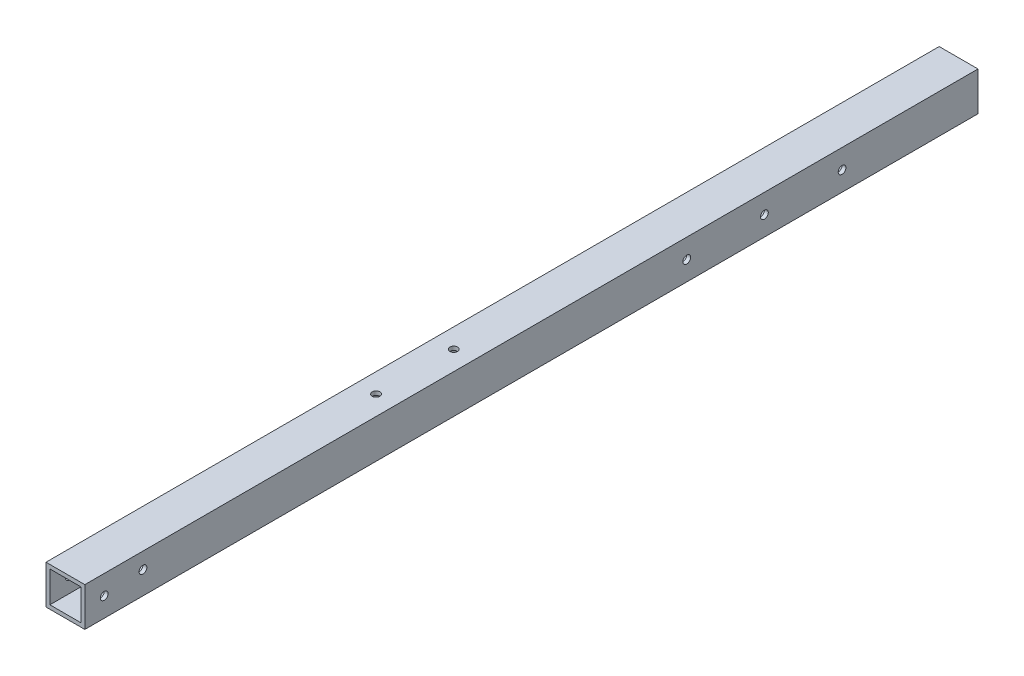
ISO-10303-21;
HEADER;
FILE_DESCRIPTION(('STEP AP214'),'2;1');
FILE_NAME('part.step','',(''),(''),'','','');
FILE_SCHEMA(('AUTOMOTIVE_DESIGN { 1 0 10303 214 1 1 1 1 }'));
ENDSEC;
DATA;
#1=APPLICATION_CONTEXT('core data for automotive mechanical design processes');
#2=APPLICATION_PROTOCOL_DEFINITION('international standard','automotive_design',2000,#1);
#3=PRODUCT_CONTEXT('',#1,'mechanical');
#4=PRODUCT('Part','Part','',(#3));
#5=PRODUCT_RELATED_PRODUCT_CATEGORY('part','',(#4));
#6=PRODUCT_DEFINITION_FORMATION('','',#4);
#7=PRODUCT_DEFINITION_CONTEXT('part definition',#1,'design');
#8=PRODUCT_DEFINITION('design','',#6,#7);
#9=PRODUCT_DEFINITION_SHAPE('','',#8);
#10=(LENGTH_UNIT() NAMED_UNIT(*) SI_UNIT(.MILLI.,.METRE.));
#11=(NAMED_UNIT(*) PLANE_ANGLE_UNIT() SI_UNIT($,.RADIAN.));
#12=(NAMED_UNIT(*) SI_UNIT($,.STERADIAN.) SOLID_ANGLE_UNIT());
#13=UNCERTAINTY_MEASURE_WITH_UNIT(LENGTH_MEASURE(1.E-05),#10,'distance_accuracy_value','');
#14=(GEOMETRIC_REPRESENTATION_CONTEXT(3) GLOBAL_UNCERTAINTY_ASSIGNED_CONTEXT((#13)) GLOBAL_UNIT_ASSIGNED_CONTEXT((#10,
#11,#12)) REPRESENTATION_CONTEXT('',''));
#15=CARTESIAN_POINT('',(0.,0.,0.));
#16=DIRECTION('',(0.,0.,1.));
#17=DIRECTION('',(1.,0.,0.));
#18=AXIS2_PLACEMENT_3D('',#15,#16,#17);
#19=CARTESIAN_POINT('',(0.,0.,460.));
#20=DIRECTION('',(0.,0.,-1.));
#21=DIRECTION('',(-1.,0.,0.));
#22=AXIS2_PLACEMENT_3D('',#19,#20,#21);
#23=PLANE('',#22);
#24=DIRECTION('',(0.,1.,0.));
#25=VECTOR('',#24,1.);
#26=CARTESIAN_POINT('',(10.,-10.,460.));
#27=LINE('',#26,#25);
#28=CARTESIAN_POINT('',(10.,-10.,460.));
#29=VERTEX_POINT('',#28);
#30=CARTESIAN_POINT('',(10.,10.,460.));
#31=VERTEX_POINT('',#30);
#32=EDGE_CURVE('E144',#29,#31,#27,.T.);
#33=ORIENTED_EDGE('',*,*,#32,.T.);
#34=DIRECTION('',(-1.,0.,0.));
#35=VECTOR('',#34,1.);
#36=CARTESIAN_POINT('',(-10.,10.,460.));
#37=LINE('',#36,#35);
#38=CARTESIAN_POINT('',(-10.,10.,460.));
#39=VERTEX_POINT('',#38);
#40=EDGE_CURVE('E147',#31,#39,#37,.T.);
#41=ORIENTED_EDGE('',*,*,#40,.T.);
#42=DIRECTION('',(0.,-1.,0.));
#43=VECTOR('',#42,1.);
#44=CARTESIAN_POINT('',(-10.,-10.,460.));
#45=LINE('',#44,#43);
#46=CARTESIAN_POINT('',(-10.,-10.,460.));
#47=VERTEX_POINT('',#46);
#48=EDGE_CURVE('E150',#39,#47,#45,.T.);
#49=ORIENTED_EDGE('',*,*,#48,.T.);
#50=DIRECTION('',(1.,0.,0.));
#51=VECTOR('',#50,1.);
#52=CARTESIAN_POINT('',(-10.,-10.,460.));
#53=LINE('',#52,#51);
#54=EDGE_CURVE('E152',#47,#29,#53,.T.);
#55=ORIENTED_EDGE('',*,*,#54,.T.);
#56=EDGE_LOOP('',(#33,#41,#49,#55));
#57=FACE_BOUND('',#56,.T.);
#58=DIRECTION('',(0.,1.,0.));
#59=VECTOR('',#58,1.);
#60=CARTESIAN_POINT('',(8.,8.,460.));
#61=LINE('',#60,#59);
#62=CARTESIAN_POINT('',(8.,-8.,460.));
#63=VERTEX_POINT('',#62);
#64=CARTESIAN_POINT('',(8.,8.,460.));
#65=VERTEX_POINT('',#64);
#66=EDGE_CURVE('E106',#63,#65,#61,.T.);
#67=ORIENTED_EDGE('',*,*,#66,.F.);
#68=DIRECTION('',(1.,0.,0.));
#69=VECTOR('',#68,1.);
#70=CARTESIAN_POINT('',(-8.,-8.,460.));
#71=LINE('',#70,#69);
#72=CARTESIAN_POINT('',(-8.,-8.,460.));
#73=VERTEX_POINT('',#72);
#74=EDGE_CURVE('E128',#73,#63,#71,.T.);
#75=ORIENTED_EDGE('',*,*,#74,.F.);
#76=DIRECTION('',(0.,-1.,0.));
#77=VECTOR('',#76,1.);
#78=CARTESIAN_POINT('',(-8.,8.,460.));
#79=LINE('',#78,#77);
#80=CARTESIAN_POINT('',(-8.,8.,460.));
#81=VERTEX_POINT('',#80);
#82=EDGE_CURVE('E126',#81,#73,#79,.T.);
#83=ORIENTED_EDGE('',*,*,#82,.F.);
#84=DIRECTION('',(-1.,0.,0.));
#85=VECTOR('',#84,1.);
#86=CARTESIAN_POINT('',(-8.,8.,460.));
#87=LINE('',#86,#85);
#88=EDGE_CURVE('E114',#65,#81,#87,.T.);
#89=ORIENTED_EDGE('',*,*,#88,.F.);
#90=EDGE_LOOP('',(#67,#75,#83,#89));
#91=FACE_BOUND('',#90,.T.);
#92=ADVANCED_FACE('F39',(#57,#91),#23,.F.);
#93=CARTESIAN_POINT('',(0.,0.,0.));
#94=DIRECTION('',(0.,0.,-1.));
#95=DIRECTION('',(-1.,0.,0.));
#96=AXIS2_PLACEMENT_3D('',#93,#94,#95);
#97=PLANE('',#96);
#98=DIRECTION('',(0.,1.,0.));
#99=VECTOR('',#98,1.);
#100=CARTESIAN_POINT('',(10.,-10.,0.));
#101=LINE('',#100,#99);
#102=CARTESIAN_POINT('',(10.,-10.,0.));
#103=VERTEX_POINT('',#102);
#104=CARTESIAN_POINT('',(10.,10.,0.));
#105=VERTEX_POINT('',#104);
#106=EDGE_CURVE('E122',#103,#105,#101,.T.);
#107=ORIENTED_EDGE('',*,*,#106,.F.);
#108=DIRECTION('',(1.,0.,0.));
#109=VECTOR('',#108,1.);
#110=CARTESIAN_POINT('',(-10.,-10.,0.));
#111=LINE('',#110,#109);
#112=CARTESIAN_POINT('',(-10.,-10.,0.));
#113=VERTEX_POINT('',#112);
#114=EDGE_CURVE('E148',#113,#103,#111,.T.);
#115=ORIENTED_EDGE('',*,*,#114,.F.);
#116=DIRECTION('',(0.,-1.,0.));
#117=VECTOR('',#116,1.);
#118=CARTESIAN_POINT('',(-10.,-10.,0.));
#119=LINE('',#118,#117);
#120=CARTESIAN_POINT('',(-10.,10.,0.));
#121=VERTEX_POINT('',#120);
#122=EDGE_CURVE('E159',#121,#113,#119,.T.);
#123=ORIENTED_EDGE('',*,*,#122,.F.);
#124=DIRECTION('',(-1.,0.,0.));
#125=VECTOR('',#124,1.);
#126=CARTESIAN_POINT('',(-10.,10.,0.));
#127=LINE('',#126,#125);
#128=EDGE_CURVE('E157',#105,#121,#127,.T.);
#129=ORIENTED_EDGE('',*,*,#128,.F.);
#130=EDGE_LOOP('',(#107,#115,#123,#129));
#131=FACE_BOUND('',#130,.T.);
#132=DIRECTION('',(1.,0.,0.));
#133=VECTOR('',#132,1.);
#134=CARTESIAN_POINT('',(-8.,-8.,0.));
#135=LINE('',#134,#133);
#136=CARTESIAN_POINT('',(-8.,-8.,0.));
#137=VERTEX_POINT('',#136);
#138=CARTESIAN_POINT('',(8.,-8.,0.));
#139=VERTEX_POINT('',#138);
#140=EDGE_CURVE('E115',#137,#139,#135,.T.);
#141=ORIENTED_EDGE('',*,*,#140,.T.);
#142=DIRECTION('',(0.,1.,0.));
#143=VECTOR('',#142,1.);
#144=CARTESIAN_POINT('',(8.,8.,0.));
#145=LINE('',#144,#143);
#146=CARTESIAN_POINT('',(8.,8.,0.));
#147=VERTEX_POINT('',#146);
#148=EDGE_CURVE('E64',#139,#147,#145,.T.);
#149=ORIENTED_EDGE('',*,*,#148,.T.);
#150=DIRECTION('',(-1.,0.,0.));
#151=VECTOR('',#150,1.);
#152=CARTESIAN_POINT('',(-8.,8.,0.));
#153=LINE('',#152,#151);
#154=CARTESIAN_POINT('',(-8.,8.,0.));
#155=VERTEX_POINT('',#154);
#156=EDGE_CURVE('E121',#147,#155,#153,.T.);
#157=ORIENTED_EDGE('',*,*,#156,.T.);
#158=DIRECTION('',(0.,-1.,0.));
#159=VECTOR('',#158,1.);
#160=CARTESIAN_POINT('',(-8.,8.,0.));
#161=LINE('',#160,#159);
#162=EDGE_CURVE('E136',#155,#137,#161,.T.);
#163=ORIENTED_EDGE('',*,*,#162,.T.);
#164=EDGE_LOOP('',(#141,#149,#157,#163));
#165=FACE_BOUND('',#164,.T.);
#166=ADVANCED_FACE('F279',(#131,#165),#97,.T.);
#167=CARTESIAN_POINT('',(10.,-10.,460.));
#168=DIRECTION('',(-1.,0.,0.));
#169=DIRECTION('',(0.,0.,1.));
#170=AXIS2_PLACEMENT_3D('',#167,#168,#169);
#171=PLANE('',#170);
#172=CARTESIAN_POINT('',(10.,0.,450.));
#173=DIRECTION('',(1.,0.,0.));
#174=DIRECTION('',(0.,0.,-1.));
#175=AXIS2_PLACEMENT_3D('',#172,#173,#174);
#176=CIRCLE('',#175,2.);
#177=CARTESIAN_POINT('',(10.,0.,448.));
#178=VERTEX_POINT('',#177);
#179=EDGE_CURVE('E216',#178,#178,#176,.T.);
#180=ORIENTED_EDGE('',*,*,#179,.F.);
#181=EDGE_LOOP('',(#180));
#182=FACE_BOUND('',#181,.T.);
#183=CARTESIAN_POINT('',(10.,-4.14197924260682E-12,150.));
#184=DIRECTION('',(1.,0.,0.));
#185=DIRECTION('',(0.,0.,-1.));
#186=AXIS2_PLACEMENT_3D('',#183,#184,#185);
#187=CIRCLE('',#186,2.);
#188=CARTESIAN_POINT('',(10.,-4.14197924260682E-12,148.));
#189=VERTEX_POINT('',#188);
#190=EDGE_CURVE('E227',#189,#189,#187,.T.);
#191=ORIENTED_EDGE('',*,*,#190,.F.);
#192=EDGE_LOOP('',(#191));
#193=FACE_BOUND('',#192,.T.);
#194=CARTESIAN_POINT('',(10.,-2.76131949507121E-12,110.));
#195=DIRECTION('',(1.,0.,0.));
#196=DIRECTION('',(0.,0.,-1.));
#197=AXIS2_PLACEMENT_3D('',#194,#195,#196);
#198=CIRCLE('',#197,2.00000000000001);
#199=CARTESIAN_POINT('',(10.,-2.76131949507121E-12,108.));
#200=VERTEX_POINT('',#199);
#201=EDGE_CURVE('E220',#200,#200,#198,.T.);
#202=ORIENTED_EDGE('',*,*,#201,.F.);
#203=EDGE_LOOP('',(#202));
#204=FACE_BOUND('',#203,.T.);
#205=CARTESIAN_POINT('',(10.,1.72258491226192,430.074320558129));
#206=DIRECTION('',(1.,0.,0.));
#207=DIRECTION('',(0.,0.,-1.));
#208=AXIS2_PLACEMENT_3D('',#205,#206,#207);
#209=CIRCLE('',#208,2.);
#210=CARTESIAN_POINT('',(10.,1.72258491226192,428.074320558129));
#211=VERTEX_POINT('',#210);
#212=EDGE_CURVE('E219',#211,#211,#209,.T.);
#213=ORIENTED_EDGE('',*,*,#212,.F.);
#214=EDGE_LOOP('',(#213));
#215=FACE_BOUND('',#214,.T.);
#216=CARTESIAN_POINT('',(10.,-1.38065974753561E-12,70.));
#217=DIRECTION('',(1.,0.,0.));
#218=DIRECTION('',(0.,0.,-1.));
#219=AXIS2_PLACEMENT_3D('',#216,#217,#218);
#220=CIRCLE('',#219,2.00000000000002);
#221=CARTESIAN_POINT('',(10.,-1.38065974753561E-12,68.));
#222=VERTEX_POINT('',#221);
#223=EDGE_CURVE('E232',#222,#222,#220,.T.);
#224=ORIENTED_EDGE('',*,*,#223,.F.);
#225=EDGE_LOOP('',(#224));
#226=FACE_BOUND('',#225,.T.);
#227=ORIENTED_EDGE('',*,*,#106,.T.);
#228=DIRECTION('',(0.,0.,-1.));
#229=VECTOR('',#228,1.);
#230=CARTESIAN_POINT('',(10.,10.,460.));
#231=LINE('',#230,#229);
#232=EDGE_CURVE('E11',#31,#105,#231,.T.);
#233=ORIENTED_EDGE('',*,*,#232,.F.);
#234=ORIENTED_EDGE('',*,*,#32,.F.);
#235=DIRECTION('',(0.,0.,-1.));
#236=VECTOR('',#235,1.);
#237=CARTESIAN_POINT('',(10.,-10.,460.));
#238=LINE('',#237,#236);
#239=EDGE_CURVE('E154',#29,#103,#238,.T.);
#240=ORIENTED_EDGE('',*,*,#239,.T.);
#241=EDGE_LOOP('',(#227,#233,#234,#240));
#242=FACE_BOUND('',#241,.T.);
#243=ADVANCED_FACE('F41',(#182,#193,#204,#215,#226,#242),#171,.F.);
#244=CARTESIAN_POINT('',(-10.,10.,460.));
#245=DIRECTION('',(0.,-1.,0.));
#246=DIRECTION('',(0.,0.,-1.));
#247=AXIS2_PLACEMENT_3D('',#244,#245,#246);
#248=PLANE('',#247);
#249=CARTESIAN_POINT('',(-1.47451495458029E-13,10.,260.));
#250=DIRECTION('',(0.,1.,0.));
#251=DIRECTION('',(0.,0.,1.));
#252=AXIS2_PLACEMENT_3D('',#249,#250,#251);
#253=CIRCLE('',#252,2.);
#254=CARTESIAN_POINT('',(-1.47451495458029E-13,10.,262.));
#255=VERTEX_POINT('',#254);
#256=EDGE_CURVE('E197',#255,#255,#253,.T.);
#257=ORIENTED_EDGE('',*,*,#256,.F.);
#258=EDGE_LOOP('',(#257));
#259=FACE_BOUND('',#258,.T.);
#260=CARTESIAN_POINT('',(-1.30104260698261E-13,10.,300.));
#261=DIRECTION('',(0.,1.,0.));
#262=DIRECTION('',(0.,0.,1.));
#263=AXIS2_PLACEMENT_3D('',#260,#261,#262);
#264=CIRCLE('',#263,2.);
#265=CARTESIAN_POINT('',(-1.30104260698261E-13,10.,302.));
#266=VERTEX_POINT('',#265);
#267=EDGE_CURVE('E202',#266,#266,#264,.T.);
#268=ORIENTED_EDGE('',*,*,#267,.F.);
#269=EDGE_LOOP('',(#268));
#270=FACE_BOUND('',#269,.T.);
#271=ORIENTED_EDGE('',*,*,#128,.T.);
#272=DIRECTION('',(0.,0.,-1.));
#273=VECTOR('',#272,1.);
#274=CARTESIAN_POINT('',(-10.,10.,460.));
#275=LINE('',#274,#273);
#276=EDGE_CURVE('E48',#39,#121,#275,.T.);
#277=ORIENTED_EDGE('',*,*,#276,.F.);
#278=ORIENTED_EDGE('',*,*,#40,.F.);
#279=ORIENTED_EDGE('',*,*,#232,.T.);
#280=EDGE_LOOP('',(#271,#277,#278,#279));
#281=FACE_BOUND('',#280,.T.);
#282=ADVANCED_FACE('F278',(#259,#270,#281),#248,.F.);
#283=CARTESIAN_POINT('',(-10.,-10.,460.));
#284=DIRECTION('',(1.,0.,0.));
#285=DIRECTION('',(0.,1.,0.));
#286=AXIS2_PLACEMENT_3D('',#283,#284,#285);
#287=PLANE('',#286);
#288=CARTESIAN_POINT('',(-10.,0.,450.));
#289=DIRECTION('',(1.,0.,0.));
#290=DIRECTION('',(0.,0.,-1.));
#291=AXIS2_PLACEMENT_3D('',#288,#289,#290);
#292=CIRCLE('',#291,2.);
#293=CARTESIAN_POINT('',(-10.,0.,448.));
#294=VERTEX_POINT('',#293);
#295=EDGE_CURVE('E173',#294,#294,#292,.T.);
#296=ORIENTED_EDGE('',*,*,#295,.T.);
#297=EDGE_LOOP('',(#296));
#298=FACE_BOUND('',#297,.T.);
#299=CARTESIAN_POINT('',(-10.,-4.14197924260682E-12,150.));
#300=DIRECTION('',(1.,0.,0.));
#301=DIRECTION('',(0.,0.,-1.));
#302=AXIS2_PLACEMENT_3D('',#299,#300,#301);
#303=CIRCLE('',#302,2.);
#304=CARTESIAN_POINT('',(-10.,-4.14197924260682E-12,148.));
#305=VERTEX_POINT('',#304);
#306=EDGE_CURVE('E213',#305,#305,#303,.T.);
#307=ORIENTED_EDGE('',*,*,#306,.T.);
#308=EDGE_LOOP('',(#307));
#309=FACE_BOUND('',#308,.T.);
#310=CARTESIAN_POINT('',(-10.,-2.76131949507121E-12,110.));
#311=DIRECTION('',(1.,0.,0.));
#312=DIRECTION('',(0.,0.,-1.));
#313=AXIS2_PLACEMENT_3D('',#310,#311,#312);
#314=CIRCLE('',#313,2.00000000000001);
#315=CARTESIAN_POINT('',(-10.,-2.76131949507121E-12,108.));
#316=VERTEX_POINT('',#315);
#317=EDGE_CURVE('E224',#316,#316,#314,.T.);
#318=ORIENTED_EDGE('',*,*,#317,.T.);
#319=EDGE_LOOP('',(#318));
#320=FACE_BOUND('',#319,.T.);
#321=CARTESIAN_POINT('',(-10.,1.72258491226192,430.074320558129));
#322=DIRECTION('',(1.,0.,0.));
#323=DIRECTION('',(0.,0.,-1.));
#324=AXIS2_PLACEMENT_3D('',#321,#322,#323);
#325=CIRCLE('',#324,2.);
#326=CARTESIAN_POINT('',(-10.,1.72258491226192,428.074320558129));
#327=VERTEX_POINT('',#326);
#328=EDGE_CURVE('E235',#327,#327,#325,.T.);
#329=ORIENTED_EDGE('',*,*,#328,.T.);
#330=EDGE_LOOP('',(#329));
#331=FACE_BOUND('',#330,.T.);
#332=CARTESIAN_POINT('',(-10.,-1.38065974753561E-12,70.));
#333=DIRECTION('',(1.,0.,0.));
#334=DIRECTION('',(0.,0.,-1.));
#335=AXIS2_PLACEMENT_3D('',#332,#333,#334);
#336=CIRCLE('',#335,2.00000000000002);
#337=CARTESIAN_POINT('',(-10.,-1.38065974753561E-12,68.));
#338=VERTEX_POINT('',#337);
#339=EDGE_CURVE('E223',#338,#338,#336,.T.);
#340=ORIENTED_EDGE('',*,*,#339,.T.);
#341=EDGE_LOOP('',(#340));
#342=FACE_BOUND('',#341,.T.);
#343=ORIENTED_EDGE('',*,*,#122,.T.);
#344=DIRECTION('',(0.,0.,-1.));
#345=VECTOR('',#344,1.);
#346=CARTESIAN_POINT('',(-10.,-10.,460.));
#347=LINE('',#346,#345);
#348=EDGE_CURVE('E164',#47,#113,#347,.T.);
#349=ORIENTED_EDGE('',*,*,#348,.F.);
#350=ORIENTED_EDGE('',*,*,#48,.F.);
#351=ORIENTED_EDGE('',*,*,#276,.T.);
#352=EDGE_LOOP('',(#343,#349,#350,#351));
#353=FACE_BOUND('',#352,.T.);
#354=ADVANCED_FACE('F297',(#298,#309,#320,#331,#342,#353),#287,.F.);
#355=CARTESIAN_POINT('',(-10.,-10.,460.));
#356=DIRECTION('',(0.,1.,0.));
#357=DIRECTION('',(0.,0.,1.));
#358=AXIS2_PLACEMENT_3D('',#355,#356,#357);
#359=PLANE('',#358);
#360=CARTESIAN_POINT('',(-1.47451495458029E-13,-10.,260.));
#361=DIRECTION('',(0.,1.,0.));
#362=DIRECTION('',(0.,0.,1.));
#363=AXIS2_PLACEMENT_3D('',#360,#361,#362);
#364=CIRCLE('',#363,2.);
#365=CARTESIAN_POINT('',(-1.47451495458029E-13,-10.,262.));
#366=VERTEX_POINT('',#365);
#367=EDGE_CURVE('E191',#366,#366,#364,.T.);
#368=ORIENTED_EDGE('',*,*,#367,.T.);
#369=EDGE_LOOP('',(#368));
#370=FACE_BOUND('',#369,.T.);
#371=CARTESIAN_POINT('',(-1.30104260698261E-13,-10.,300.));
#372=DIRECTION('',(0.,1.,0.));
#373=DIRECTION('',(0.,0.,1.));
#374=AXIS2_PLACEMENT_3D('',#371,#372,#373);
#375=CIRCLE('',#374,2.);
#376=CARTESIAN_POINT('',(-1.30104260698261E-13,-10.,302.));
#377=VERTEX_POINT('',#376);
#378=EDGE_CURVE('E207',#377,#377,#375,.T.);
#379=ORIENTED_EDGE('',*,*,#378,.T.);
#380=EDGE_LOOP('',(#379));
#381=FACE_BOUND('',#380,.T.);
#382=ORIENTED_EDGE('',*,*,#114,.T.);
#383=ORIENTED_EDGE('',*,*,#239,.F.);
#384=ORIENTED_EDGE('',*,*,#54,.F.);
#385=ORIENTED_EDGE('',*,*,#348,.T.);
#386=EDGE_LOOP('',(#382,#383,#384,#385));
#387=FACE_BOUND('',#386,.T.);
#388=ADVANCED_FACE('F257',(#370,#381,#387),#359,.F.);
#389=CARTESIAN_POINT('',(8.,8.,460.));
#390=DIRECTION('',(-1.,0.,0.));
#391=DIRECTION('',(0.,-1.,0.));
#392=AXIS2_PLACEMENT_3D('',#389,#390,#391);
#393=PLANE('',#392);
#394=CARTESIAN_POINT('',(8.,0.,450.));
#395=DIRECTION('',(-1.,0.,0.));
#396=DIRECTION('',(0.,-1.,0.));
#397=AXIS2_PLACEMENT_3D('',#394,#395,#396);
#398=CIRCLE('',#397,2.);
#399=CARTESIAN_POINT('',(8.,-2.,450.));
#400=VERTEX_POINT('',#399);
#401=EDGE_CURVE('E134',#400,#400,#398,.T.);
#402=ORIENTED_EDGE('',*,*,#401,.F.);
#403=EDGE_LOOP('',(#402));
#404=FACE_BOUND('',#403,.T.);
#405=CARTESIAN_POINT('',(8.,-4.14197924260682E-12,150.));
#406=DIRECTION('',(-1.,0.,0.));
#407=DIRECTION('',(0.,-1.,0.));
#408=AXIS2_PLACEMENT_3D('',#405,#406,#407);
#409=CIRCLE('',#408,2.);
#410=CARTESIAN_POINT('',(8.,-2.00000000000414,150.));
#411=VERTEX_POINT('',#410);
#412=EDGE_CURVE('E185',#411,#411,#409,.T.);
#413=ORIENTED_EDGE('',*,*,#412,.F.);
#414=EDGE_LOOP('',(#413));
#415=FACE_BOUND('',#414,.T.);
#416=CARTESIAN_POINT('',(8.,-2.76131949507121E-12,110.));
#417=DIRECTION('',(-1.,0.,0.));
#418=DIRECTION('',(0.,-1.,0.));
#419=AXIS2_PLACEMENT_3D('',#416,#417,#418);
#420=CIRCLE('',#419,2.00000000000001);
#421=CARTESIAN_POINT('',(8.,-2.00000000000277,110.));
#422=VERTEX_POINT('',#421);
#423=EDGE_CURVE('E181',#422,#422,#420,.T.);
#424=ORIENTED_EDGE('',*,*,#423,.F.);
#425=EDGE_LOOP('',(#424));
#426=FACE_BOUND('',#425,.T.);
#427=CARTESIAN_POINT('',(8.,1.72258491226192,430.074320558129));
#428=DIRECTION('',(-1.,0.,0.));
#429=DIRECTION('',(0.,-1.,0.));
#430=AXIS2_PLACEMENT_3D('',#427,#428,#429);
#431=CIRCLE('',#430,2.);
#432=CARTESIAN_POINT('',(8.,-0.277415087738076,430.074320558129));
#433=VERTEX_POINT('',#432);
#434=EDGE_CURVE('E177',#433,#433,#431,.T.);
#435=ORIENTED_EDGE('',*,*,#434,.F.);
#436=EDGE_LOOP('',(#435));
#437=FACE_BOUND('',#436,.T.);
#438=CARTESIAN_POINT('',(8.,-1.38065974753561E-12,70.));
#439=DIRECTION('',(-1.,0.,0.));
#440=DIRECTION('',(0.,-1.,0.));
#441=AXIS2_PLACEMENT_3D('',#438,#439,#440);
#442=CIRCLE('',#441,2.00000000000002);
#443=CARTESIAN_POINT('',(8.,-2.0000000000014,70.));
#444=VERTEX_POINT('',#443);
#445=EDGE_CURVE('E172',#444,#444,#442,.T.);
#446=ORIENTED_EDGE('',*,*,#445,.F.);
#447=EDGE_LOOP('',(#446));
#448=FACE_BOUND('',#447,.T.);
#449=ORIENTED_EDGE('',*,*,#148,.F.);
#450=DIRECTION('',(0.,0.,-1.));
#451=VECTOR('',#450,1.);
#452=CARTESIAN_POINT('',(8.,-8.,460.));
#453=LINE('',#452,#451);
#454=EDGE_CURVE('E110',#63,#139,#453,.T.);
#455=ORIENTED_EDGE('',*,*,#454,.F.);
#456=ORIENTED_EDGE('',*,*,#66,.T.);
#457=DIRECTION('',(0.,0.,-1.));
#458=VECTOR('',#457,1.);
#459=CARTESIAN_POINT('',(8.,8.,460.));
#460=LINE('',#459,#458);
#461=EDGE_CURVE('E109',#65,#147,#460,.T.);
#462=ORIENTED_EDGE('',*,*,#461,.T.);
#463=EDGE_LOOP('',(#449,#455,#456,#462));
#464=FACE_BOUND('',#463,.T.);
#465=ADVANCED_FACE('F108',(#404,#415,#426,#437,#448,#464),#393,.T.);
#466=CARTESIAN_POINT('',(-8.,8.,460.));
#467=DIRECTION('',(0.,-1.,0.));
#468=DIRECTION('',(0.,0.,-1.));
#469=AXIS2_PLACEMENT_3D('',#466,#467,#468);
#470=PLANE('',#469);
#471=CARTESIAN_POINT('',(-1.47451495458029E-13,8.,260.));
#472=DIRECTION('',(0.,-1.,0.));
#473=DIRECTION('',(0.,0.,-1.));
#474=AXIS2_PLACEMENT_3D('',#471,#472,#473);
#475=CIRCLE('',#474,2.);
#476=CARTESIAN_POINT('',(-1.47451495458029E-13,8.,258.));
#477=VERTEX_POINT('',#476);
#478=EDGE_CURVE('E210',#477,#477,#475,.T.);
#479=ORIENTED_EDGE('',*,*,#478,.F.);
#480=EDGE_LOOP('',(#479));
#481=FACE_BOUND('',#480,.T.);
#482=CARTESIAN_POINT('',(-1.30104260698261E-13,8.,300.));
#483=DIRECTION('',(0.,-1.,0.));
#484=DIRECTION('',(0.,0.,-1.));
#485=AXIS2_PLACEMENT_3D('',#482,#483,#484);
#486=CIRCLE('',#485,2.);
#487=CARTESIAN_POINT('',(-1.30104260698261E-13,8.,298.));
#488=VERTEX_POINT('',#487);
#489=EDGE_CURVE('E190',#488,#488,#486,.T.);
#490=ORIENTED_EDGE('',*,*,#489,.F.);
#491=EDGE_LOOP('',(#490));
#492=FACE_BOUND('',#491,.T.);
#493=ORIENTED_EDGE('',*,*,#156,.F.);
#494=ORIENTED_EDGE('',*,*,#461,.F.);
#495=ORIENTED_EDGE('',*,*,#88,.T.);
#496=DIRECTION('',(0.,0.,-1.));
#497=VECTOR('',#496,1.);
#498=CARTESIAN_POINT('',(-8.,8.,460.));
#499=LINE('',#498,#497);
#500=EDGE_CURVE('E123',#81,#155,#499,.T.);
#501=ORIENTED_EDGE('',*,*,#500,.T.);
#502=EDGE_LOOP('',(#493,#494,#495,#501));
#503=FACE_BOUND('',#502,.T.);
#504=ADVANCED_FACE('F118',(#481,#492,#503),#470,.T.);
#505=CARTESIAN_POINT('',(-8.,8.,460.));
#506=DIRECTION('',(1.,0.,0.));
#507=DIRECTION('',(0.,1.,0.));
#508=AXIS2_PLACEMENT_3D('',#505,#506,#507);
#509=PLANE('',#508);
#510=CARTESIAN_POINT('',(-8.,0.,450.));
#511=DIRECTION('',(1.,0.,0.));
#512=DIRECTION('',(0.,1.,0.));
#513=AXIS2_PLACEMENT_3D('',#510,#511,#512);
#514=CIRCLE('',#513,2.);
#515=CARTESIAN_POINT('',(-8.,2.,450.));
#516=VERTEX_POINT('',#515);
#517=EDGE_CURVE('E186',#516,#516,#514,.T.);
#518=ORIENTED_EDGE('',*,*,#517,.F.);
#519=EDGE_LOOP('',(#518));
#520=FACE_BOUND('',#519,.T.);
#521=CARTESIAN_POINT('',(-8.,-4.14197924260682E-12,150.));
#522=DIRECTION('',(1.,0.,0.));
#523=DIRECTION('',(0.,1.,0.));
#524=AXIS2_PLACEMENT_3D('',#521,#522,#523);
#525=CIRCLE('',#524,2.);
#526=CARTESIAN_POINT('',(-8.,1.99999999999585,150.));
#527=VERTEX_POINT('',#526);
#528=EDGE_CURVE('E182',#527,#527,#525,.T.);
#529=ORIENTED_EDGE('',*,*,#528,.F.);
#530=EDGE_LOOP('',(#529));
#531=FACE_BOUND('',#530,.T.);
#532=CARTESIAN_POINT('',(-8.,-2.76131949507121E-12,110.));
#533=DIRECTION('',(1.,0.,0.));
#534=DIRECTION('',(0.,1.,0.));
#535=AXIS2_PLACEMENT_3D('',#532,#533,#534);
#536=CIRCLE('',#535,2.00000000000001);
#537=CARTESIAN_POINT('',(-8.,1.99999999999725,110.));
#538=VERTEX_POINT('',#537);
#539=EDGE_CURVE('E178',#538,#538,#536,.T.);
#540=ORIENTED_EDGE('',*,*,#539,.F.);
#541=EDGE_LOOP('',(#540));
#542=FACE_BOUND('',#541,.T.);
#543=CARTESIAN_POINT('',(-8.,1.72258491226192,430.074320558129));
#544=DIRECTION('',(1.,0.,0.));
#545=DIRECTION('',(0.,1.,0.));
#546=AXIS2_PLACEMENT_3D('',#543,#544,#545);
#547=CIRCLE('',#546,2.);
#548=CARTESIAN_POINT('',(-8.,3.72258491226192,430.074320558129));
#549=VERTEX_POINT('',#548);
#550=EDGE_CURVE('E174',#549,#549,#547,.T.);
#551=ORIENTED_EDGE('',*,*,#550,.F.);
#552=EDGE_LOOP('',(#551));
#553=FACE_BOUND('',#552,.T.);
#554=CARTESIAN_POINT('',(-8.,-1.38065974753561E-12,70.));
#555=DIRECTION('',(1.,0.,0.));
#556=DIRECTION('',(0.,1.,0.));
#557=AXIS2_PLACEMENT_3D('',#554,#555,#556);
#558=CIRCLE('',#557,2.00000000000002);
#559=CARTESIAN_POINT('',(-8.,1.99999999999864,70.));
#560=VERTEX_POINT('',#559);
#561=EDGE_CURVE('E169',#560,#560,#558,.T.);
#562=ORIENTED_EDGE('',*,*,#561,.F.);
#563=EDGE_LOOP('',(#562));
#564=FACE_BOUND('',#563,.T.);
#565=ORIENTED_EDGE('',*,*,#162,.F.);
#566=ORIENTED_EDGE('',*,*,#500,.F.);
#567=ORIENTED_EDGE('',*,*,#82,.T.);
#568=DIRECTION('',(0.,0.,-1.));
#569=VECTOR('',#568,1.);
#570=CARTESIAN_POINT('',(-8.,-8.,460.));
#571=LINE('',#570,#569);
#572=EDGE_CURVE('E56',#73,#137,#571,.T.);
#573=ORIENTED_EDGE('',*,*,#572,.T.);
#574=EDGE_LOOP('',(#565,#566,#567,#573));
#575=FACE_BOUND('',#574,.T.);
#576=ADVANCED_FACE('F317',(#520,#531,#542,#553,#564,#575),#509,.T.);
#577=CARTESIAN_POINT('',(-8.,-8.,460.));
#578=DIRECTION('',(0.,1.,0.));
#579=DIRECTION('',(-1.,0.,0.));
#580=AXIS2_PLACEMENT_3D('',#577,#578,#579);
#581=PLANE('',#580);
#582=CARTESIAN_POINT('',(-1.47451495458029E-13,-8.,260.));
#583=DIRECTION('',(0.,1.,0.));
#584=DIRECTION('',(-1.,0.,0.));
#585=AXIS2_PLACEMENT_3D('',#582,#583,#584);
#586=CIRCLE('',#585,2.);
#587=CARTESIAN_POINT('',(-2.00000000000015,-8.,260.));
#588=VERTEX_POINT('',#587);
#589=EDGE_CURVE('E43',#588,#588,#586,.T.);
#590=ORIENTED_EDGE('',*,*,#589,.F.);
#591=EDGE_LOOP('',(#590));
#592=FACE_BOUND('',#591,.T.);
#593=CARTESIAN_POINT('',(-1.30104260698261E-13,-8.,300.));
#594=DIRECTION('',(0.,1.,0.));
#595=DIRECTION('',(-1.,0.,0.));
#596=AXIS2_PLACEMENT_3D('',#593,#594,#595);
#597=CIRCLE('',#596,2.);
#598=CARTESIAN_POINT('',(-2.00000000000013,-8.,300.));
#599=VERTEX_POINT('',#598);
#600=EDGE_CURVE('E188',#599,#599,#597,.T.);
#601=ORIENTED_EDGE('',*,*,#600,.F.);
#602=EDGE_LOOP('',(#601));
#603=FACE_BOUND('',#602,.T.);
#604=ORIENTED_EDGE('',*,*,#140,.F.);
#605=ORIENTED_EDGE('',*,*,#572,.F.);
#606=ORIENTED_EDGE('',*,*,#74,.T.);
#607=ORIENTED_EDGE('',*,*,#454,.T.);
#608=EDGE_LOOP('',(#604,#605,#606,#607));
#609=FACE_BOUND('',#608,.T.);
#610=ADVANCED_FACE('F321',(#592,#603,#609),#581,.T.);
#611=CARTESIAN_POINT('',(-10.,-1.38065974753561E-12,70.));
#612=DIRECTION('',(1.,0.,0.));
#613=DIRECTION('',(0.,0.,-1.));
#614=AXIS2_PLACEMENT_3D('',#611,#612,#613);
#615=CYLINDRICAL_SURFACE('',#614,2.00000000000002);
#616=ORIENTED_EDGE('',*,*,#561,.T.);
#617=EDGE_LOOP('',(#616));
#618=FACE_BOUND('',#617,.T.);
#619=ORIENTED_EDGE('',*,*,#339,.F.);
#620=EDGE_LOOP('',(#619));
#621=FACE_BOUND('',#620,.T.);
#622=ADVANCED_FACE('F273',(#618,#621),#615,.F.);
#623=CARTESIAN_POINT('',(-10.,1.72258491226192,430.074320558129));
#624=DIRECTION('',(1.,0.,0.));
#625=DIRECTION('',(0.,0.,-1.));
#626=AXIS2_PLACEMENT_3D('',#623,#624,#625);
#627=CYLINDRICAL_SURFACE('',#626,2.);
#628=ORIENTED_EDGE('',*,*,#550,.T.);
#629=EDGE_LOOP('',(#628));
#630=FACE_BOUND('',#629,.T.);
#631=ORIENTED_EDGE('',*,*,#328,.F.);
#632=EDGE_LOOP('',(#631));
#633=FACE_BOUND('',#632,.T.);
#634=ADVANCED_FACE('F326',(#630,#633),#627,.F.);
#635=CARTESIAN_POINT('',(-10.,-2.76131949507121E-12,110.));
#636=DIRECTION('',(1.,0.,0.));
#637=DIRECTION('',(0.,0.,-1.));
#638=AXIS2_PLACEMENT_3D('',#635,#636,#637);
#639=CYLINDRICAL_SURFACE('',#638,2.00000000000001);
#640=ORIENTED_EDGE('',*,*,#539,.T.);
#641=EDGE_LOOP('',(#640));
#642=FACE_BOUND('',#641,.T.);
#643=ORIENTED_EDGE('',*,*,#317,.F.);
#644=EDGE_LOOP('',(#643));
#645=FACE_BOUND('',#644,.T.);
#646=ADVANCED_FACE('F328',(#642,#645),#639,.F.);
#647=CARTESIAN_POINT('',(-10.,-4.14197924260682E-12,150.));
#648=DIRECTION('',(1.,0.,0.));
#649=DIRECTION('',(0.,0.,-1.));
#650=AXIS2_PLACEMENT_3D('',#647,#648,#649);
#651=CYLINDRICAL_SURFACE('',#650,2.);
#652=ORIENTED_EDGE('',*,*,#528,.T.);
#653=EDGE_LOOP('',(#652));
#654=FACE_BOUND('',#653,.T.);
#655=ORIENTED_EDGE('',*,*,#306,.F.);
#656=EDGE_LOOP('',(#655));
#657=FACE_BOUND('',#656,.T.);
#658=ADVANCED_FACE('F333',(#654,#657),#651,.F.);
#659=CARTESIAN_POINT('',(-10.,0.,450.));
#660=DIRECTION('',(1.,0.,0.));
#661=DIRECTION('',(0.,0.,-1.));
#662=AXIS2_PLACEMENT_3D('',#659,#660,#661);
#663=CYLINDRICAL_SURFACE('',#662,2.);
#664=ORIENTED_EDGE('',*,*,#517,.T.);
#665=EDGE_LOOP('',(#664));
#666=FACE_BOUND('',#665,.T.);
#667=ORIENTED_EDGE('',*,*,#295,.F.);
#668=EDGE_LOOP('',(#667));
#669=FACE_BOUND('',#668,.T.);
#670=ADVANCED_FACE('F271',(#666,#669),#663,.F.);
#671=ORIENTED_EDGE('',*,*,#445,.T.);
#672=EDGE_LOOP('',(#671));
#673=FACE_BOUND('',#672,.T.);
#674=ORIENTED_EDGE('',*,*,#223,.T.);
#675=EDGE_LOOP('',(#674));
#676=FACE_BOUND('',#675,.T.);
#677=ADVANCED_FACE('F267',(#673,#676),#615,.F.);
#678=ORIENTED_EDGE('',*,*,#434,.T.);
#679=EDGE_LOOP('',(#678));
#680=FACE_BOUND('',#679,.T.);
#681=ORIENTED_EDGE('',*,*,#212,.T.);
#682=EDGE_LOOP('',(#681));
#683=FACE_BOUND('',#682,.T.);
#684=ADVANCED_FACE('F270',(#680,#683),#627,.F.);
#685=ORIENTED_EDGE('',*,*,#423,.T.);
#686=EDGE_LOOP('',(#685));
#687=FACE_BOUND('',#686,.T.);
#688=ORIENTED_EDGE('',*,*,#201,.T.);
#689=EDGE_LOOP('',(#688));
#690=FACE_BOUND('',#689,.T.);
#691=ADVANCED_FACE('F341',(#687,#690),#639,.F.);
#692=ORIENTED_EDGE('',*,*,#412,.T.);
#693=EDGE_LOOP('',(#692));
#694=FACE_BOUND('',#693,.T.);
#695=ORIENTED_EDGE('',*,*,#190,.T.);
#696=EDGE_LOOP('',(#695));
#697=FACE_BOUND('',#696,.T.);
#698=ADVANCED_FACE('F337',(#694,#697),#651,.F.);
#699=ORIENTED_EDGE('',*,*,#401,.T.);
#700=EDGE_LOOP('',(#699));
#701=FACE_BOUND('',#700,.T.);
#702=ORIENTED_EDGE('',*,*,#179,.T.);
#703=EDGE_LOOP('',(#702));
#704=FACE_BOUND('',#703,.T.);
#705=ADVANCED_FACE('F252',(#701,#704),#663,.F.);
#706=CARTESIAN_POINT('',(-1.30104260698261E-13,-10.,300.));
#707=DIRECTION('',(0.,1.,0.));
#708=DIRECTION('',(0.,0.,1.));
#709=AXIS2_PLACEMENT_3D('',#706,#707,#708);
#710=CYLINDRICAL_SURFACE('',#709,2.);
#711=ORIENTED_EDGE('',*,*,#600,.T.);
#712=EDGE_LOOP('',(#711));
#713=FACE_BOUND('',#712,.T.);
#714=ORIENTED_EDGE('',*,*,#378,.F.);
#715=EDGE_LOOP('',(#714));
#716=FACE_BOUND('',#715,.T.);
#717=ADVANCED_FACE('F345',(#713,#716),#710,.F.);
#718=CARTESIAN_POINT('',(-1.47451495458029E-13,-10.,260.));
#719=DIRECTION('',(0.,1.,0.));
#720=DIRECTION('',(0.,0.,1.));
#721=AXIS2_PLACEMENT_3D('',#718,#719,#720);
#722=CYLINDRICAL_SURFACE('',#721,2.);
#723=ORIENTED_EDGE('',*,*,#589,.T.);
#724=EDGE_LOOP('',(#723));
#725=FACE_BOUND('',#724,.T.);
#726=ORIENTED_EDGE('',*,*,#367,.F.);
#727=EDGE_LOOP('',(#726));
#728=FACE_BOUND('',#727,.T.);
#729=ADVANCED_FACE('F348',(#725,#728),#722,.F.);
#730=ORIENTED_EDGE('',*,*,#489,.T.);
#731=EDGE_LOOP('',(#730));
#732=FACE_BOUND('',#731,.T.);
#733=ORIENTED_EDGE('',*,*,#267,.T.);
#734=EDGE_LOOP('',(#733));
#735=FACE_BOUND('',#734,.T.);
#736=ADVANCED_FACE('F349',(#732,#735),#710,.F.);
#737=ORIENTED_EDGE('',*,*,#478,.T.);
#738=EDGE_LOOP('',(#737));
#739=FACE_BOUND('',#738,.T.);
#740=ORIENTED_EDGE('',*,*,#256,.T.);
#741=EDGE_LOOP('',(#740));
#742=FACE_BOUND('',#741,.T.);
#743=ADVANCED_FACE('F352',(#739,#742),#722,.F.);
#744=CLOSED_SHELL('',(#92,#166,#243,#282,#354,#388,#465,#504,#576,#610,#622,#634,#646,#658,#670,
#677,#684,#691,#698,#705,#717,#729,#736,#743));
#745=MANIFOLD_SOLID_BREP('B2',#744);
#746=ADVANCED_BREP_SHAPE_REPRESENTATION('',(#18,#745),#14);
#747=SHAPE_DEFINITION_REPRESENTATION(#9,#746);
ENDSEC;
END-ISO-10303-21;
